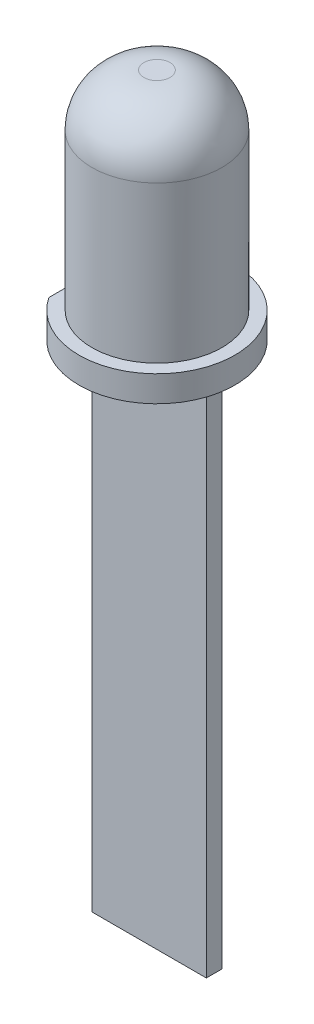
ISO-10303-21;
HEADER;
FILE_DESCRIPTION(('STEP AP214'),'2;1');
FILE_NAME('part.step','',(''),(''),'','','');
FILE_SCHEMA(('AUTOMOTIVE_DESIGN { 1 0 10303 214 1 1 1 1 }'));
ENDSEC;
DATA;
#1=APPLICATION_CONTEXT('core data for automotive mechanical design processes');
#2=APPLICATION_PROTOCOL_DEFINITION('international standard','automotive_design',2000,#1);
#3=PRODUCT_CONTEXT('',#1,'mechanical');
#4=PRODUCT('Part','Part','',(#3));
#5=PRODUCT_RELATED_PRODUCT_CATEGORY('part','',(#4));
#6=PRODUCT_DEFINITION_FORMATION('','',#4);
#7=PRODUCT_DEFINITION_CONTEXT('part definition',#1,'design');
#8=PRODUCT_DEFINITION('design','',#6,#7);
#9=PRODUCT_DEFINITION_SHAPE('','',#8);
#10=(LENGTH_UNIT() NAMED_UNIT(*) SI_UNIT(.MILLI.,.METRE.));
#11=(NAMED_UNIT(*) PLANE_ANGLE_UNIT() SI_UNIT($,.RADIAN.));
#12=(NAMED_UNIT(*) SI_UNIT($,.STERADIAN.) SOLID_ANGLE_UNIT());
#13=UNCERTAINTY_MEASURE_WITH_UNIT(LENGTH_MEASURE(1.E-05),#10,'distance_accuracy_value','');
#14=(GEOMETRIC_REPRESENTATION_CONTEXT(3) GLOBAL_UNCERTAINTY_ASSIGNED_CONTEXT((#13)) GLOBAL_UNIT_ASSIGNED_CONTEXT((#10,
#11,#12)) REPRESENTATION_CONTEXT('',''));
#15=CARTESIAN_POINT('',(0.,0.,0.));
#16=DIRECTION('',(0.,0.,1.));
#17=DIRECTION('',(1.,0.,0.));
#18=AXIS2_PLACEMENT_3D('',#15,#16,#17);
#19=CARTESIAN_POINT('',(0.,0.,0.));
#20=DIRECTION('',(0.,1.,0.));
#21=DIRECTION('',(0.,0.,1.));
#22=AXIS2_PLACEMENT_3D('',#19,#20,#21);
#23=PLANE('',#22);
#24=DIRECTION('',(0.,0.,1.));
#25=VECTOR('',#24,1.);
#26=CARTESIAN_POINT('',(2.2,0.,0.3));
#27=LINE('',#26,#25);
#28=CARTESIAN_POINT('',(2.2,0.,-0.3));
#29=VERTEX_POINT('',#28);
#30=CARTESIAN_POINT('',(2.2,0.,0.3));
#31=VERTEX_POINT('',#30);
#32=EDGE_CURVE('E100',#29,#31,#27,.T.);
#33=ORIENTED_EDGE('',*,*,#32,.F.);
#34=DIRECTION('',(1.,0.,0.));
#35=VECTOR('',#34,1.);
#36=CARTESIAN_POINT('',(-2.2,0.,-0.3));
#37=LINE('',#36,#35);
#38=CARTESIAN_POINT('',(-2.2,0.,-0.3));
#39=VERTEX_POINT('',#38);
#40=EDGE_CURVE('E133',#39,#29,#37,.T.);
#41=ORIENTED_EDGE('',*,*,#40,.F.);
#42=DIRECTION('',(0.,0.,-1.));
#43=VECTOR('',#42,1.);
#44=CARTESIAN_POINT('',(-2.2,0.,0.3));
#45=LINE('',#44,#43);
#46=CARTESIAN_POINT('',(-2.2,0.,0.3));
#47=VERTEX_POINT('',#46);
#48=EDGE_CURVE('E137',#47,#39,#45,.T.);
#49=ORIENTED_EDGE('',*,*,#48,.F.);
#50=DIRECTION('',(-1.,0.,0.));
#51=VECTOR('',#50,1.);
#52=CARTESIAN_POINT('',(-2.2,0.,0.3));
#53=LINE('',#52,#51);
#54=EDGE_CURVE('E56',#31,#47,#53,.T.);
#55=ORIENTED_EDGE('',*,*,#54,.F.);
#56=EDGE_LOOP('',(#33,#41,#49,#55));
#57=FACE_BOUND('',#56,.T.);
#58=DIRECTION('',(0.,0.,1.));
#59=VECTOR('',#58,1.);
#60=CARTESIAN_POINT('',(-2.5,0.,0.));
#61=LINE('',#60,#59);
#62=CARTESIAN_POINT('',(-2.5,0.,-1.6583123951777));
#63=VERTEX_POINT('',#62);
#64=CARTESIAN_POINT('',(-2.5,0.,1.6583123951777));
#65=VERTEX_POINT('',#64);
#66=EDGE_CURVE('E149',#63,#65,#61,.T.);
#67=ORIENTED_EDGE('',*,*,#66,.F.);
#68=CARTESIAN_POINT('',(0.,0.,0.));
#69=DIRECTION('',(0.,1.,0.));
#70=DIRECTION('',(0.,0.,1.));
#71=AXIS2_PLACEMENT_3D('',#68,#69,#70);
#72=CIRCLE('',#71,3.);
#73=EDGE_CURVE('E107',#65,#63,#72,.T.);
#74=ORIENTED_EDGE('',*,*,#73,.F.);
#75=EDGE_LOOP('',(#67,#74));
#76=FACE_BOUND('',#75,.T.);
#77=ADVANCED_FACE('F33',(#57,#76),#23,.F.);
#78=CARTESIAN_POINT('',(0.,1.,0.));
#79=DIRECTION('',(0.,-1.,0.));
#80=DIRECTION('',(0.,0.,-1.));
#81=AXIS2_PLACEMENT_3D('',#78,#79,#80);
#82=CYLINDRICAL_SURFACE('',#81,3.);
#83=DIRECTION('',(0.,-1.,0.));
#84=VECTOR('',#83,1.);
#85=CARTESIAN_POINT('',(-2.5,1.,-1.6583123951777));
#86=LINE('',#85,#84);
#87=CARTESIAN_POINT('',(-2.5,1.,-1.6583123951777));
#88=VERTEX_POINT('',#87);
#89=EDGE_CURVE('E101',#88,#63,#86,.T.);
#90=ORIENTED_EDGE('',*,*,#89,.F.);
#91=CARTESIAN_POINT('',(0.,1.,0.));
#92=DIRECTION('',(0.,1.,0.));
#93=DIRECTION('',(0.,0.,1.));
#94=AXIS2_PLACEMENT_3D('',#91,#92,#93);
#95=CIRCLE('',#94,3.);
#96=CARTESIAN_POINT('',(-2.5,1.,1.6583123951777));
#97=VERTEX_POINT('',#96);
#98=EDGE_CURVE('E99',#97,#88,#95,.T.);
#99=ORIENTED_EDGE('',*,*,#98,.F.);
#100=DIRECTION('',(0.,-1.,0.));
#101=VECTOR('',#100,1.);
#102=CARTESIAN_POINT('',(-2.5,1.,1.6583123951777));
#103=LINE('',#102,#101);
#104=EDGE_CURVE('E48',#65,#97,#103,.F.);
#105=ORIENTED_EDGE('',*,*,#104,.F.);
#106=ORIENTED_EDGE('',*,*,#73,.T.);
#107=EDGE_LOOP('',(#90,#99,#105,#106));
#108=FACE_BOUND('',#107,.T.);
#109=ADVANCED_FACE('F153',(#108),#82,.T.);
#110=CARTESIAN_POINT('',(0.,1.,0.));
#111=DIRECTION('',(0.,1.,0.));
#112=DIRECTION('',(0.,0.,1.));
#113=AXIS2_PLACEMENT_3D('',#110,#111,#112);
#114=PLANE('',#113);
#115=ORIENTED_EDGE('',*,*,#98,.T.);
#116=DIRECTION('',(0.,0.,1.));
#117=VECTOR('',#116,1.);
#118=CARTESIAN_POINT('',(-2.5,1.,0.));
#119=LINE('',#118,#117);
#120=CARTESIAN_POINT('',(-2.5,1.,0.));
#121=VERTEX_POINT('',#120);
#122=EDGE_CURVE('E89',#88,#121,#119,.T.);
#123=ORIENTED_EDGE('',*,*,#122,.T.);
#124=CARTESIAN_POINT('',(0.,1.,0.));
#125=DIRECTION('',(0.,1.,0.));
#126=DIRECTION('',(0.,0.,1.));
#127=AXIS2_PLACEMENT_3D('',#124,#125,#126);
#128=CIRCLE('',#127,2.5);
#129=EDGE_CURVE('E98',#121,#121,#128,.T.);
#130=ORIENTED_EDGE('',*,*,#129,.F.);
#131=EDGE_CURVE('E86',#121,#97,#119,.T.);
#132=ORIENTED_EDGE('',*,*,#131,.T.);
#133=EDGE_LOOP('',(#115,#123,#130,#132));
#134=FACE_BOUND('',#133,.T.);
#135=ADVANCED_FACE('F97',(#134),#114,.T.);
#136=CARTESIAN_POINT('',(0.,9.,0.));
#137=DIRECTION('',(0.,-1.,0.));
#138=DIRECTION('',(0.,0.,-1.));
#139=AXIS2_PLACEMENT_3D('',#136,#137,#138);
#140=CYLINDRICAL_SURFACE('',#139,2.5);
#141=ORIENTED_EDGE('',*,*,#129,.T.);
#142=EDGE_LOOP('',(#141));
#143=FACE_BOUND('',#142,.T.);
#144=CARTESIAN_POINT('',(0.,7.,0.));
#145=DIRECTION('',(0.,1.,0.));
#146=DIRECTION('',(0.,0.,1.));
#147=AXIS2_PLACEMENT_3D('',#144,#145,#146);
#148=CIRCLE('',#147,2.5);
#149=CARTESIAN_POINT('',(0.,7.,2.5));
#150=VERTEX_POINT('',#149);
#151=EDGE_CURVE('E11',#150,#150,#148,.F.);
#152=ORIENTED_EDGE('',*,*,#151,.T.);
#153=EDGE_LOOP('',(#152));
#154=FACE_BOUND('',#153,.T.);
#155=ADVANCED_FACE('F103',(#143,#154),#140,.T.);
#156=CARTESIAN_POINT('',(0.,9.,0.));
#157=DIRECTION('',(0.,1.,0.));
#158=DIRECTION('',(0.,0.,1.));
#159=AXIS2_PLACEMENT_3D('',#156,#157,#158);
#160=PLANE('',#159);
#161=CARTESIAN_POINT('',(0.,9.,0.));
#162=DIRECTION('',(0.,1.,0.));
#163=DIRECTION('',(0.,0.,1.));
#164=AXIS2_PLACEMENT_3D('',#161,#162,#163);
#165=CIRCLE('',#164,0.5);
#166=CARTESIAN_POINT('',(0.,9.,0.5));
#167=VERTEX_POINT('',#166);
#168=EDGE_CURVE('E41',#167,#167,#165,.T.);
#169=ORIENTED_EDGE('',*,*,#168,.T.);
#170=EDGE_LOOP('',(#169));
#171=FACE_BOUND('',#170,.T.);
#172=ADVANCED_FACE('F164',(#171),#160,.T.);
#173=CARTESIAN_POINT('',(0.,7.,0.));
#174=DIRECTION('',(0.,1.,0.));
#175=DIRECTION('',(0.,0.,1.));
#176=AXIS2_PLACEMENT_3D('',#173,#174,#175);
#177=DEGENERATE_TOROIDAL_SURFACE('',#176,0.5,2.,.T.);
#178=ORIENTED_EDGE('',*,*,#151,.F.);
#179=EDGE_LOOP('',(#178));
#180=FACE_BOUND('',#179,.T.);
#181=ORIENTED_EDGE('',*,*,#168,.F.);
#182=EDGE_LOOP('',(#181));
#183=FACE_BOUND('',#182,.T.);
#184=ADVANCED_FACE('F35',(#180,#183),#177,.T.);
#185=CARTESIAN_POINT('',(2.2,-20.,0.3));
#186=DIRECTION('',(-1.,0.,0.));
#187=DIRECTION('',(0.,0.,1.));
#188=AXIS2_PLACEMENT_3D('',#185,#186,#187);
#189=PLANE('',#188);
#190=ORIENTED_EDGE('',*,*,#32,.T.);
#191=DIRECTION('',(0.,1.,0.));
#192=VECTOR('',#191,1.);
#193=CARTESIAN_POINT('',(2.2,-20.,0.3));
#194=LINE('',#193,#192);
#195=CARTESIAN_POINT('',(2.2,-20.,0.3));
#196=VERTEX_POINT('',#195);
#197=EDGE_CURVE('E110',#196,#31,#194,.T.);
#198=ORIENTED_EDGE('',*,*,#197,.F.);
#199=DIRECTION('',(0.,0.,1.));
#200=VECTOR('',#199,1.);
#201=CARTESIAN_POINT('',(2.2,-20.,0.3));
#202=LINE('',#201,#200);
#203=CARTESIAN_POINT('',(2.2,-20.,-0.3));
#204=VERTEX_POINT('',#203);
#205=EDGE_CURVE('E136',#204,#196,#202,.T.);
#206=ORIENTED_EDGE('',*,*,#205,.F.);
#207=DIRECTION('',(0.,1.,0.));
#208=VECTOR('',#207,1.);
#209=CARTESIAN_POINT('',(2.2,-20.,-0.3));
#210=LINE('',#209,#208);
#211=EDGE_CURVE('E127',#204,#29,#210,.T.);
#212=ORIENTED_EDGE('',*,*,#211,.T.);
#213=EDGE_LOOP('',(#190,#198,#206,#212));
#214=FACE_BOUND('',#213,.T.);
#215=ADVANCED_FACE('F168',(#214),#189,.F.);
#216=CARTESIAN_POINT('',(-2.2,-20.,0.3));
#217=DIRECTION('',(0.,0.,-1.));
#218=DIRECTION('',(-1.,0.,0.));
#219=AXIS2_PLACEMENT_3D('',#216,#217,#218);
#220=PLANE('',#219);
#221=ORIENTED_EDGE('',*,*,#54,.T.);
#222=DIRECTION('',(0.,1.,0.));
#223=VECTOR('',#222,1.);
#224=CARTESIAN_POINT('',(-2.2,-20.,0.3));
#225=LINE('',#224,#223);
#226=CARTESIAN_POINT('',(-2.2,-20.,0.3));
#227=VERTEX_POINT('',#226);
#228=EDGE_CURVE('E116',#227,#47,#225,.T.);
#229=ORIENTED_EDGE('',*,*,#228,.F.);
#230=DIRECTION('',(-1.,0.,0.));
#231=VECTOR('',#230,1.);
#232=CARTESIAN_POINT('',(-2.2,-20.,0.3));
#233=LINE('',#232,#231);
#234=EDGE_CURVE('E144',#196,#227,#233,.T.);
#235=ORIENTED_EDGE('',*,*,#234,.F.);
#236=ORIENTED_EDGE('',*,*,#197,.T.);
#237=EDGE_LOOP('',(#221,#229,#235,#236));
#238=FACE_BOUND('',#237,.T.);
#239=ADVANCED_FACE('F171',(#238),#220,.F.);
#240=CARTESIAN_POINT('',(-2.2,-20.,0.3));
#241=DIRECTION('',(1.,0.,0.));
#242=DIRECTION('',(0.,0.,-1.));
#243=AXIS2_PLACEMENT_3D('',#240,#241,#242);
#244=PLANE('',#243);
#245=ORIENTED_EDGE('',*,*,#48,.T.);
#246=DIRECTION('',(0.,1.,0.));
#247=VECTOR('',#246,1.);
#248=CARTESIAN_POINT('',(-2.2,-20.,-0.3));
#249=LINE('',#248,#247);
#250=CARTESIAN_POINT('',(-2.2,-20.,-0.3));
#251=VERTEX_POINT('',#250);
#252=EDGE_CURVE('E121',#251,#39,#249,.T.);
#253=ORIENTED_EDGE('',*,*,#252,.F.);
#254=DIRECTION('',(0.,0.,-1.));
#255=VECTOR('',#254,1.);
#256=CARTESIAN_POINT('',(-2.2,-20.,0.3));
#257=LINE('',#256,#255);
#258=EDGE_CURVE('E142',#227,#251,#257,.T.);
#259=ORIENTED_EDGE('',*,*,#258,.F.);
#260=ORIENTED_EDGE('',*,*,#228,.T.);
#261=EDGE_LOOP('',(#245,#253,#259,#260));
#262=FACE_BOUND('',#261,.T.);
#263=ADVANCED_FACE('F175',(#262),#244,.F.);
#264=CARTESIAN_POINT('',(-2.2,-20.,-0.3));
#265=DIRECTION('',(0.,0.,1.));
#266=DIRECTION('',(1.,0.,0.));
#267=AXIS2_PLACEMENT_3D('',#264,#265,#266);
#268=PLANE('',#267);
#269=ORIENTED_EDGE('',*,*,#40,.T.);
#270=ORIENTED_EDGE('',*,*,#211,.F.);
#271=DIRECTION('',(1.,0.,0.));
#272=VECTOR('',#271,1.);
#273=CARTESIAN_POINT('',(-2.2,-20.,-0.3));
#274=LINE('',#273,#272);
#275=EDGE_CURVE('E132',#251,#204,#274,.T.);
#276=ORIENTED_EDGE('',*,*,#275,.F.);
#277=ORIENTED_EDGE('',*,*,#252,.T.);
#278=EDGE_LOOP('',(#269,#270,#276,#277));
#279=FACE_BOUND('',#278,.T.);
#280=ADVANCED_FACE('F178',(#279),#268,.F.);
#281=CARTESIAN_POINT('',(0.,-20.,0.));
#282=DIRECTION('',(0.,-1.,0.));
#283=DIRECTION('',(0.,0.,-1.));
#284=AXIS2_PLACEMENT_3D('',#281,#282,#283);
#285=PLANE('',#284);
#286=ORIENTED_EDGE('',*,*,#205,.T.);
#287=ORIENTED_EDGE('',*,*,#234,.T.);
#288=ORIENTED_EDGE('',*,*,#258,.T.);
#289=ORIENTED_EDGE('',*,*,#275,.T.);
#290=EDGE_LOOP('',(#286,#287,#288,#289));
#291=FACE_BOUND('',#290,.T.);
#292=ADVANCED_FACE('F181',(#291),#285,.T.);
#293=CARTESIAN_POINT('',(-2.5,0.,0.));
#294=DIRECTION('',(-1.,0.,0.));
#295=DIRECTION('',(0.,0.,1.));
#296=AXIS2_PLACEMENT_3D('',#293,#294,#295);
#297=PLANE('',#296);
#298=ORIENTED_EDGE('',*,*,#89,.T.);
#299=ORIENTED_EDGE('',*,*,#66,.T.);
#300=ORIENTED_EDGE('',*,*,#104,.T.);
#301=ORIENTED_EDGE('',*,*,#131,.F.);
#302=ORIENTED_EDGE('',*,*,#122,.F.);
#303=EDGE_LOOP('',(#298,#299,#300,#301,#302));
#304=FACE_BOUND('',#303,.T.);
#305=ADVANCED_FACE('F88',(#304),#297,.T.);
#306=CLOSED_SHELL('',(#77,#109,#135,#155,#172,#184,#215,#239,#263,#280,#292,#305));
#307=MANIFOLD_SOLID_BREP('B2',#306);
#308=ADVANCED_BREP_SHAPE_REPRESENTATION('',(#18,#307),#14);
#309=SHAPE_DEFINITION_REPRESENTATION(#9,#308);
ENDSEC;
END-ISO-10303-21;
